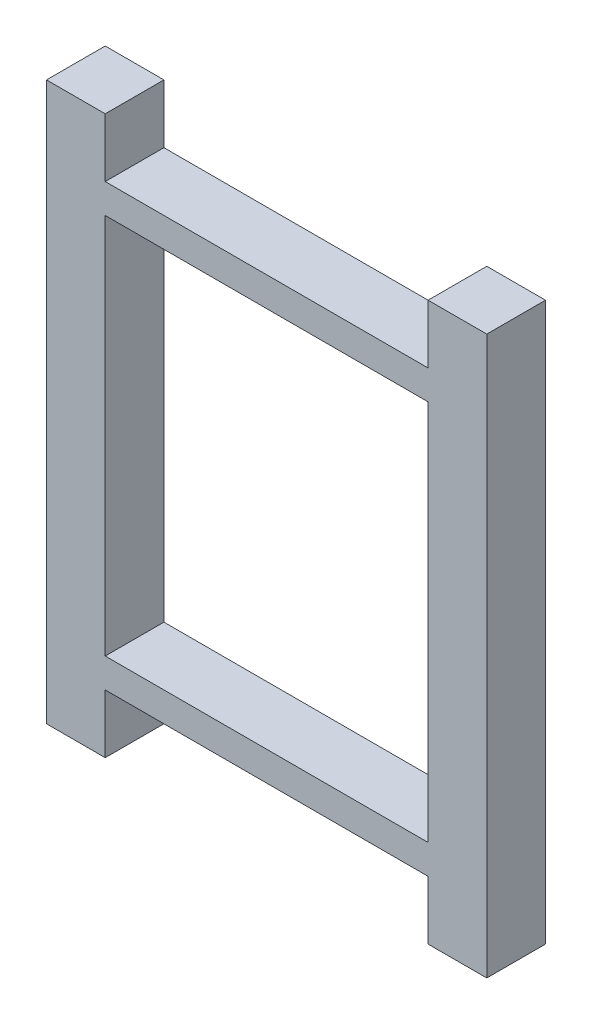
ISO-10303-21;
HEADER;
FILE_DESCRIPTION(('STEP AP214'),'2;1');
FILE_NAME('part.step','',(''),(''),'','','');
FILE_SCHEMA(('AUTOMOTIVE_DESIGN { 1 0 10303 214 1 1 1 1 }'));
ENDSEC;
DATA;
#1=APPLICATION_CONTEXT('core data for automotive mechanical design processes');
#2=APPLICATION_PROTOCOL_DEFINITION('international standard','automotive_design',2000,#1);
#3=PRODUCT_CONTEXT('',#1,'mechanical');
#4=PRODUCT('Part','Part','',(#3));
#5=PRODUCT_RELATED_PRODUCT_CATEGORY('part','',(#4));
#6=PRODUCT_DEFINITION_FORMATION('','',#4);
#7=PRODUCT_DEFINITION_CONTEXT('part definition',#1,'design');
#8=PRODUCT_DEFINITION('design','',#6,#7);
#9=PRODUCT_DEFINITION_SHAPE('','',#8);
#10=(LENGTH_UNIT() NAMED_UNIT(*) SI_UNIT(.MILLI.,.METRE.));
#11=(NAMED_UNIT(*) PLANE_ANGLE_UNIT() SI_UNIT($,.RADIAN.));
#12=(NAMED_UNIT(*) SI_UNIT($,.STERADIAN.) SOLID_ANGLE_UNIT());
#13=UNCERTAINTY_MEASURE_WITH_UNIT(LENGTH_MEASURE(1.E-05),#10,'distance_accuracy_value','');
#14=(GEOMETRIC_REPRESENTATION_CONTEXT(3) GLOBAL_UNCERTAINTY_ASSIGNED_CONTEXT((#13)) GLOBAL_UNIT_ASSIGNED_CONTEXT((#10,
#11,#12)) REPRESENTATION_CONTEXT('',''));
#15=CARTESIAN_POINT('',(0.,0.,0.));
#16=DIRECTION('',(0.,0.,1.));
#17=DIRECTION('',(1.,0.,0.));
#18=AXIS2_PLACEMENT_3D('',#15,#16,#17);
#19=CARTESIAN_POINT('',(0.,48.,6.));
#20=DIRECTION('',(0.,1.,0.));
#21=DIRECTION('',(0.,0.,1.));
#22=AXIS2_PLACEMENT_3D('',#19,#20,#21);
#23=PLANE('',#22);
#24=DIRECTION('',(1.,0.,0.));
#25=VECTOR('',#24,1.);
#26=CARTESIAN_POINT('',(0.,48.,0.));
#27=LINE('',#26,#25);
#28=CARTESIAN_POINT('',(-39.,48.,0.));
#29=VERTEX_POINT('',#28);
#30=CARTESIAN_POINT('',(-6.,48.,0.));
#31=VERTEX_POINT('',#30);
#32=EDGE_CURVE('E209',#29,#31,#27,.T.);
#33=ORIENTED_EDGE('',*,*,#32,.T.);
#34=DIRECTION('',(0.,0.,-1.));
#35=VECTOR('',#34,1.);
#36=CARTESIAN_POINT('',(-6.,48.,6.));
#37=LINE('',#36,#35);
#38=CARTESIAN_POINT('',(-6.,48.,6.));
#39=VERTEX_POINT('',#38);
#40=EDGE_CURVE('E11',#39,#31,#37,.T.);
#41=ORIENTED_EDGE('',*,*,#40,.F.);
#42=DIRECTION('',(1.,0.,0.));
#43=VECTOR('',#42,1.);
#44=CARTESIAN_POINT('',(0.,48.,6.));
#45=LINE('',#44,#43);
#46=CARTESIAN_POINT('',(-39.,48.,6.));
#47=VERTEX_POINT('',#46);
#48=EDGE_CURVE('E162',#47,#39,#45,.T.);
#49=ORIENTED_EDGE('',*,*,#48,.F.);
#50=DIRECTION('',(0.,0.,-1.));
#51=VECTOR('',#50,1.);
#52=CARTESIAN_POINT('',(-39.,48.,6.));
#53=LINE('',#52,#51);
#54=EDGE_CURVE('E54',#47,#29,#53,.T.);
#55=ORIENTED_EDGE('',*,*,#54,.T.);
#56=EDGE_LOOP('',(#33,#41,#49,#55));
#57=FACE_BOUND('',#56,.T.);
#58=ADVANCED_FACE('F35',(#57),#23,.F.);
#59=CARTESIAN_POINT('',(-6.,0.,6.));
#60=DIRECTION('',(1.,0.,0.));
#61=DIRECTION('',(0.,0.,-1.));
#62=AXIS2_PLACEMENT_3D('',#59,#60,#61);
#63=PLANE('',#62);
#64=DIRECTION('',(0.,-1.,0.));
#65=VECTOR('',#64,1.);
#66=CARTESIAN_POINT('',(-6.,0.,0.));
#67=LINE('',#66,#65);
#68=CARTESIAN_POINT('',(-6.,9.,0.));
#69=VERTEX_POINT('',#68);
#70=EDGE_CURVE('E168',#31,#69,#67,.T.);
#71=ORIENTED_EDGE('',*,*,#70,.T.);
#72=DIRECTION('',(0.,0.,-1.));
#73=VECTOR('',#72,1.);
#74=CARTESIAN_POINT('',(-6.,9.,6.));
#75=LINE('',#74,#73);
#76=CARTESIAN_POINT('',(-6.,9.,6.));
#77=VERTEX_POINT('',#76);
#78=EDGE_CURVE('E45',#77,#69,#75,.T.);
#79=ORIENTED_EDGE('',*,*,#78,.F.);
#80=DIRECTION('',(0.,-1.,0.));
#81=VECTOR('',#80,1.);
#82=CARTESIAN_POINT('',(-6.,0.,6.));
#83=LINE('',#82,#81);
#84=EDGE_CURVE('E156',#39,#77,#83,.T.);
#85=ORIENTED_EDGE('',*,*,#84,.F.);
#86=ORIENTED_EDGE('',*,*,#40,.T.);
#87=EDGE_LOOP('',(#71,#79,#85,#86));
#88=FACE_BOUND('',#87,.T.);
#89=ADVANCED_FACE('F167',(#88),#63,.F.);
#90=CARTESIAN_POINT('',(0.,9.,6.));
#91=DIRECTION('',(0.,1.,0.));
#92=DIRECTION('',(0.,0.,1.));
#93=AXIS2_PLACEMENT_3D('',#90,#91,#92);
#94=PLANE('',#93);
#95=DIRECTION('',(1.,0.,0.));
#96=VECTOR('',#95,1.);
#97=CARTESIAN_POINT('',(0.,9.,0.));
#98=LINE('',#97,#96);
#99=CARTESIAN_POINT('',(-39.,9.,0.));
#100=VERTEX_POINT('',#99);
#101=EDGE_CURVE('E212',#100,#69,#98,.T.);
#102=ORIENTED_EDGE('',*,*,#101,.F.);
#103=DIRECTION('',(0.,0.,-1.));
#104=VECTOR('',#103,1.);
#105=CARTESIAN_POINT('',(-39.,9.,6.));
#106=LINE('',#105,#104);
#107=CARTESIAN_POINT('',(-39.,9.,6.));
#108=VERTEX_POINT('',#107);
#109=EDGE_CURVE('E104',#108,#100,#106,.T.);
#110=ORIENTED_EDGE('',*,*,#109,.F.);
#111=DIRECTION('',(1.,0.,0.));
#112=VECTOR('',#111,1.);
#113=CARTESIAN_POINT('',(0.,9.,6.));
#114=LINE('',#113,#112);
#115=EDGE_CURVE('E161',#108,#77,#114,.T.);
#116=ORIENTED_EDGE('',*,*,#115,.T.);
#117=ORIENTED_EDGE('',*,*,#78,.T.);
#118=EDGE_LOOP('',(#102,#110,#116,#117));
#119=FACE_BOUND('',#118,.T.);
#120=ADVANCED_FACE('F172',(#119),#94,.T.);
#121=CARTESIAN_POINT('',(-39.,0.,6.));
#122=DIRECTION('',(1.,0.,0.));
#123=DIRECTION('',(0.,1.,0.));
#124=AXIS2_PLACEMENT_3D('',#121,#122,#123);
#125=PLANE('',#124);
#126=DIRECTION('',(0.,-1.,0.));
#127=VECTOR('',#126,1.);
#128=CARTESIAN_POINT('',(-39.,0.,0.));
#129=LINE('',#128,#127);
#130=CARTESIAN_POINT('',(-39.,6.,0.));
#131=VERTEX_POINT('',#130);
#132=CARTESIAN_POINT('',(-39.,0.,0.));
#133=VERTEX_POINT('',#132);
#134=EDGE_CURVE('E179',#131,#133,#129,.T.);
#135=ORIENTED_EDGE('',*,*,#134,.F.);
#136=DIRECTION('',(0.,0.,-1.));
#137=VECTOR('',#136,1.);
#138=CARTESIAN_POINT('',(-39.,6.,6.));
#139=LINE('',#138,#137);
#140=CARTESIAN_POINT('',(-39.,6.,6.));
#141=VERTEX_POINT('',#140);
#142=EDGE_CURVE('E39',#141,#131,#139,.T.);
#143=ORIENTED_EDGE('',*,*,#142,.F.);
#144=DIRECTION('',(0.,-1.,0.));
#145=VECTOR('',#144,1.);
#146=CARTESIAN_POINT('',(-39.,0.,6.));
#147=LINE('',#146,#145);
#148=CARTESIAN_POINT('',(-39.,0.,6.));
#149=VERTEX_POINT('',#148);
#150=EDGE_CURVE('E217',#141,#149,#147,.T.);
#151=ORIENTED_EDGE('',*,*,#150,.T.);
#152=DIRECTION('',(0.,0.,-1.));
#153=VECTOR('',#152,1.);
#154=CARTESIAN_POINT('',(-39.,0.,6.));
#155=LINE('',#154,#153);
#156=EDGE_CURVE('E175',#149,#133,#155,.T.);
#157=ORIENTED_EDGE('',*,*,#156,.T.);
#158=EDGE_LOOP('',(#135,#143,#151,#157));
#159=FACE_BOUND('',#158,.T.);
#160=ADVANCED_FACE('F37',(#159),#125,.T.);
#161=CARTESIAN_POINT('',(0.,6.,6.));
#162=DIRECTION('',(0.,-1.,0.));
#163=DIRECTION('',(1.,0.,0.));
#164=AXIS2_PLACEMENT_3D('',#161,#162,#163);
#165=PLANE('',#164);
#166=DIRECTION('',(-1.,0.,0.));
#167=VECTOR('',#166,1.);
#168=CARTESIAN_POINT('',(0.,6.,0.));
#169=LINE('',#168,#167);
#170=CARTESIAN_POINT('',(-6.,6.,0.));
#171=VERTEX_POINT('',#170);
#172=EDGE_CURVE('E182',#171,#131,#169,.T.);
#173=ORIENTED_EDGE('',*,*,#172,.F.);
#174=DIRECTION('',(0.,0.,-1.));
#175=VECTOR('',#174,1.);
#176=CARTESIAN_POINT('',(-6.,6.,6.));
#177=LINE('',#176,#175);
#178=CARTESIAN_POINT('',(-6.,6.,6.));
#179=VERTEX_POINT('',#178);
#180=EDGE_CURVE('E240',#179,#171,#177,.T.);
#181=ORIENTED_EDGE('',*,*,#180,.F.);
#182=DIRECTION('',(-1.,0.,0.));
#183=VECTOR('',#182,1.);
#184=CARTESIAN_POINT('',(0.,6.,6.));
#185=LINE('',#184,#183);
#186=EDGE_CURVE('E249',#179,#141,#185,.T.);
#187=ORIENTED_EDGE('',*,*,#186,.T.);
#188=ORIENTED_EDGE('',*,*,#142,.T.);
#189=EDGE_LOOP('',(#173,#181,#187,#188));
#190=FACE_BOUND('',#189,.T.);
#191=ADVANCED_FACE('F247',(#190),#165,.T.);
#192=CARTESIAN_POINT('',(-6.,0.,6.));
#193=DIRECTION('',(-1.,0.,0.));
#194=DIRECTION('',(0.,-1.,0.));
#195=AXIS2_PLACEMENT_3D('',#192,#193,#194);
#196=PLANE('',#195);
#197=DIRECTION('',(0.,1.,0.));
#198=VECTOR('',#197,1.);
#199=CARTESIAN_POINT('',(-6.,0.,0.));
#200=LINE('',#199,#198);
#201=CARTESIAN_POINT('',(-6.,0.,0.));
#202=VERTEX_POINT('',#201);
#203=EDGE_CURVE('E185',#202,#171,#200,.T.);
#204=ORIENTED_EDGE('',*,*,#203,.F.);
#205=DIRECTION('',(0.,0.,-1.));
#206=VECTOR('',#205,1.);
#207=CARTESIAN_POINT('',(-6.,0.,6.));
#208=LINE('',#207,#206);
#209=CARTESIAN_POINT('',(-6.,0.,6.));
#210=VERTEX_POINT('',#209);
#211=EDGE_CURVE('E239',#210,#202,#208,.T.);
#212=ORIENTED_EDGE('',*,*,#211,.F.);
#213=DIRECTION('',(0.,1.,0.));
#214=VECTOR('',#213,1.);
#215=CARTESIAN_POINT('',(-6.,0.,6.));
#216=LINE('',#215,#214);
#217=EDGE_CURVE('E259',#210,#179,#216,.T.);
#218=ORIENTED_EDGE('',*,*,#217,.T.);
#219=ORIENTED_EDGE('',*,*,#180,.T.);
#220=EDGE_LOOP('',(#204,#212,#218,#219));
#221=FACE_BOUND('',#220,.T.);
#222=ADVANCED_FACE('F257',(#221),#196,.T.);
#223=CARTESIAN_POINT('',(0.,0.,6.));
#224=DIRECTION('',(0.,-1.,0.));
#225=DIRECTION('',(1.,0.,0.));
#226=AXIS2_PLACEMENT_3D('',#223,#224,#225);
#227=PLANE('',#226);
#228=DIRECTION('',(-1.,0.,0.));
#229=VECTOR('',#228,1.);
#230=CARTESIAN_POINT('',(0.,0.,0.));
#231=LINE('',#230,#229);
#232=CARTESIAN_POINT('',(0.,0.,0.));
#233=VERTEX_POINT('',#232);
#234=EDGE_CURVE('E188',#233,#202,#231,.T.);
#235=ORIENTED_EDGE('',*,*,#234,.F.);
#236=DIRECTION('',(0.,0.,-1.));
#237=VECTOR('',#236,1.);
#238=CARTESIAN_POINT('',(0.,0.,6.));
#239=LINE('',#238,#237);
#240=CARTESIAN_POINT('',(0.,0.,6.));
#241=VERTEX_POINT('',#240);
#242=EDGE_CURVE('E237',#241,#233,#239,.T.);
#243=ORIENTED_EDGE('',*,*,#242,.F.);
#244=DIRECTION('',(-1.,0.,0.));
#245=VECTOR('',#244,1.);
#246=CARTESIAN_POINT('',(0.,0.,6.));
#247=LINE('',#246,#245);
#248=EDGE_CURVE('E264',#241,#210,#247,.T.);
#249=ORIENTED_EDGE('',*,*,#248,.T.);
#250=ORIENTED_EDGE('',*,*,#211,.T.);
#251=EDGE_LOOP('',(#235,#243,#249,#250));
#252=FACE_BOUND('',#251,.T.);
#253=ADVANCED_FACE('F266',(#252),#227,.T.);
#254=CARTESIAN_POINT('',(0.,0.,6.));
#255=DIRECTION('',(-1.,0.,0.));
#256=DIRECTION('',(0.,-1.,0.));
#257=AXIS2_PLACEMENT_3D('',#254,#255,#256);
#258=PLANE('',#257);
#259=DIRECTION('',(0.,1.,0.));
#260=VECTOR('',#259,1.);
#261=CARTESIAN_POINT('',(0.,0.,0.));
#262=LINE('',#261,#260);
#263=CARTESIAN_POINT('',(0.,57.,0.));
#264=VERTEX_POINT('',#263);
#265=EDGE_CURVE('E191',#233,#264,#262,.T.);
#266=ORIENTED_EDGE('',*,*,#265,.T.);
#267=DIRECTION('',(0.,0.,-1.));
#268=VECTOR('',#267,1.);
#269=CARTESIAN_POINT('',(0.,57.,6.));
#270=LINE('',#269,#268);
#271=CARTESIAN_POINT('',(0.,57.,6.));
#272=VERTEX_POINT('',#271);
#273=EDGE_CURVE('E234',#272,#264,#270,.T.);
#274=ORIENTED_EDGE('',*,*,#273,.F.);
#275=DIRECTION('',(0.,1.,0.));
#276=VECTOR('',#275,1.);
#277=CARTESIAN_POINT('',(0.,0.,6.));
#278=LINE('',#277,#276);
#279=EDGE_CURVE('E268',#241,#272,#278,.T.);
#280=ORIENTED_EDGE('',*,*,#279,.F.);
#281=ORIENTED_EDGE('',*,*,#242,.T.);
#282=EDGE_LOOP('',(#266,#274,#280,#281));
#283=FACE_BOUND('',#282,.T.);
#284=ADVANCED_FACE('F332',(#283),#258,.F.);
#285=CARTESIAN_POINT('',(0.,57.,6.));
#286=DIRECTION('',(0.,-1.,0.));
#287=DIRECTION('',(1.,0.,0.));
#288=AXIS2_PLACEMENT_3D('',#285,#286,#287);
#289=PLANE('',#288);
#290=DIRECTION('',(-1.,0.,0.));
#291=VECTOR('',#290,1.);
#292=CARTESIAN_POINT('',(0.,57.,0.));
#293=LINE('',#292,#291);
#294=CARTESIAN_POINT('',(-6.,57.,0.));
#295=VERTEX_POINT('',#294);
#296=EDGE_CURVE('E194',#264,#295,#293,.T.);
#297=ORIENTED_EDGE('',*,*,#296,.T.);
#298=DIRECTION('',(0.,0.,-1.));
#299=VECTOR('',#298,1.);
#300=CARTESIAN_POINT('',(-6.,57.,6.));
#301=LINE('',#300,#299);
#302=CARTESIAN_POINT('',(-6.,57.,6.));
#303=VERTEX_POINT('',#302);
#304=EDGE_CURVE('E232',#303,#295,#301,.T.);
#305=ORIENTED_EDGE('',*,*,#304,.F.);
#306=DIRECTION('',(-1.,0.,0.));
#307=VECTOR('',#306,1.);
#308=CARTESIAN_POINT('',(0.,57.,6.));
#309=LINE('',#308,#307);
#310=EDGE_CURVE('E271',#272,#303,#309,.T.);
#311=ORIENTED_EDGE('',*,*,#310,.F.);
#312=ORIENTED_EDGE('',*,*,#273,.T.);
#313=EDGE_LOOP('',(#297,#305,#311,#312));
#314=FACE_BOUND('',#313,.T.);
#315=ADVANCED_FACE('F297',(#314),#289,.F.);
#316=CARTESIAN_POINT('',(-6.,0.,6.));
#317=DIRECTION('',(-1.,0.,0.));
#318=DIRECTION('',(0.,0.,1.));
#319=AXIS2_PLACEMENT_3D('',#316,#317,#318);
#320=PLANE('',#319);
#321=DIRECTION('',(0.,1.,0.));
#322=VECTOR('',#321,1.);
#323=CARTESIAN_POINT('',(-6.,0.,0.));
#324=LINE('',#323,#322);
#325=CARTESIAN_POINT('',(-6.,51.,0.));
#326=VERTEX_POINT('',#325);
#327=EDGE_CURVE('E197',#326,#295,#324,.T.);
#328=ORIENTED_EDGE('',*,*,#327,.F.);
#329=DIRECTION('',(0.,0.,-1.));
#330=VECTOR('',#329,1.);
#331=CARTESIAN_POINT('',(-6.,51.,6.));
#332=LINE('',#331,#330);
#333=CARTESIAN_POINT('',(-6.,51.,6.));
#334=VERTEX_POINT('',#333);
#335=EDGE_CURVE('E230',#334,#326,#332,.T.);
#336=ORIENTED_EDGE('',*,*,#335,.F.);
#337=DIRECTION('',(0.,1.,0.));
#338=VECTOR('',#337,1.);
#339=CARTESIAN_POINT('',(-6.,0.,6.));
#340=LINE('',#339,#338);
#341=EDGE_CURVE('E289',#334,#303,#340,.T.);
#342=ORIENTED_EDGE('',*,*,#341,.T.);
#343=ORIENTED_EDGE('',*,*,#304,.T.);
#344=EDGE_LOOP('',(#328,#336,#342,#343));
#345=FACE_BOUND('',#344,.T.);
#346=ADVANCED_FACE('F301',(#345),#320,.T.);
#347=CARTESIAN_POINT('',(0.,51.,6.));
#348=DIRECTION('',(0.,1.,0.));
#349=DIRECTION('',(-1.,0.,0.));
#350=AXIS2_PLACEMENT_3D('',#347,#348,#349);
#351=PLANE('',#350);
#352=DIRECTION('',(1.,0.,0.));
#353=VECTOR('',#352,1.);
#354=CARTESIAN_POINT('',(0.,51.,0.));
#355=LINE('',#354,#353);
#356=CARTESIAN_POINT('',(-39.,51.,0.));
#357=VERTEX_POINT('',#356);
#358=EDGE_CURVE('E201',#357,#326,#355,.T.);
#359=ORIENTED_EDGE('',*,*,#358,.F.);
#360=DIRECTION('',(0.,0.,-1.));
#361=VECTOR('',#360,1.);
#362=CARTESIAN_POINT('',(-39.,51.,6.));
#363=LINE('',#362,#361);
#364=CARTESIAN_POINT('',(-39.,51.,6.));
#365=VERTEX_POINT('',#364);
#366=EDGE_CURVE('E228',#365,#357,#363,.T.);
#367=ORIENTED_EDGE('',*,*,#366,.F.);
#368=DIRECTION('',(1.,0.,0.));
#369=VECTOR('',#368,1.);
#370=CARTESIAN_POINT('',(0.,51.,6.));
#371=LINE('',#370,#369);
#372=EDGE_CURVE('E286',#365,#334,#371,.T.);
#373=ORIENTED_EDGE('',*,*,#372,.T.);
#374=ORIENTED_EDGE('',*,*,#335,.T.);
#375=EDGE_LOOP('',(#359,#367,#373,#374));
#376=FACE_BOUND('',#375,.T.);
#377=ADVANCED_FACE('F304',(#376),#351,.T.);
#378=CARTESIAN_POINT('',(-39.,0.,6.));
#379=DIRECTION('',(-1.,0.,0.));
#380=DIRECTION('',(0.,0.,1.));
#381=AXIS2_PLACEMENT_3D('',#378,#379,#380);
#382=PLANE('',#381);
#383=DIRECTION('',(0.,1.,0.));
#384=VECTOR('',#383,1.);
#385=CARTESIAN_POINT('',(-39.,0.,0.));
#386=LINE('',#385,#384);
#387=CARTESIAN_POINT('',(-39.,57.,0.));
#388=VERTEX_POINT('',#387);
#389=EDGE_CURVE('E204',#357,#388,#386,.T.);
#390=ORIENTED_EDGE('',*,*,#389,.T.);
#391=DIRECTION('',(0.,0.,-1.));
#392=VECTOR('',#391,1.);
#393=CARTESIAN_POINT('',(-39.,57.,6.));
#394=LINE('',#393,#392);
#395=CARTESIAN_POINT('',(-39.,57.,6.));
#396=VERTEX_POINT('',#395);
#397=EDGE_CURVE('E225',#396,#388,#394,.T.);
#398=ORIENTED_EDGE('',*,*,#397,.F.);
#399=DIRECTION('',(0.,1.,0.));
#400=VECTOR('',#399,1.);
#401=CARTESIAN_POINT('',(-39.,0.,6.));
#402=LINE('',#401,#400);
#403=EDGE_CURVE('E282',#365,#396,#402,.T.);
#404=ORIENTED_EDGE('',*,*,#403,.F.);
#405=ORIENTED_EDGE('',*,*,#366,.T.);
#406=EDGE_LOOP('',(#390,#398,#404,#405));
#407=FACE_BOUND('',#406,.T.);
#408=ADVANCED_FACE('F310',(#407),#382,.F.);
#409=CARTESIAN_POINT('',(-45.,57.,0.));
#410=VERTEX_POINT('',#409);
#411=EDGE_CURVE('E198',#388,#410,#293,.T.);
#412=ORIENTED_EDGE('',*,*,#411,.T.);
#413=DIRECTION('',(0.,0.,-1.));
#414=VECTOR('',#413,1.);
#415=CARTESIAN_POINT('',(-45.,57.,6.));
#416=LINE('',#415,#414);
#417=CARTESIAN_POINT('',(-45.,57.,6.));
#418=VERTEX_POINT('',#417);
#419=EDGE_CURVE('E223',#418,#410,#416,.T.);
#420=ORIENTED_EDGE('',*,*,#419,.F.);
#421=EDGE_CURVE('E278',#396,#418,#309,.T.);
#422=ORIENTED_EDGE('',*,*,#421,.F.);
#423=ORIENTED_EDGE('',*,*,#397,.T.);
#424=EDGE_LOOP('',(#412,#420,#422,#423));
#425=FACE_BOUND('',#424,.T.);
#426=ADVANCED_FACE('F315',(#425),#289,.F.);
#427=CARTESIAN_POINT('',(-45.,0.,6.));
#428=DIRECTION('',(-1.,0.,0.));
#429=DIRECTION('',(0.,0.,1.));
#430=AXIS2_PLACEMENT_3D('',#427,#428,#429);
#431=PLANE('',#430);
#432=DIRECTION('',(0.,1.,0.));
#433=VECTOR('',#432,1.);
#434=CARTESIAN_POINT('',(-45.,0.,0.));
#435=LINE('',#434,#433);
#436=CARTESIAN_POINT('',(-45.,0.,0.));
#437=VERTEX_POINT('',#436);
#438=EDGE_CURVE('E206',#437,#410,#435,.T.);
#439=ORIENTED_EDGE('',*,*,#438,.F.);
#440=DIRECTION('',(0.,0.,-1.));
#441=VECTOR('',#440,1.);
#442=CARTESIAN_POINT('',(-45.,0.,6.));
#443=LINE('',#442,#441);
#444=CARTESIAN_POINT('',(-45.,0.,6.));
#445=VERTEX_POINT('',#444);
#446=EDGE_CURVE('E221',#445,#437,#443,.T.);
#447=ORIENTED_EDGE('',*,*,#446,.F.);
#448=DIRECTION('',(0.,1.,0.));
#449=VECTOR('',#448,1.);
#450=CARTESIAN_POINT('',(-45.,0.,6.));
#451=LINE('',#450,#449);
#452=EDGE_CURVE('E274',#445,#418,#451,.T.);
#453=ORIENTED_EDGE('',*,*,#452,.T.);
#454=ORIENTED_EDGE('',*,*,#419,.T.);
#455=EDGE_LOOP('',(#439,#447,#453,#454));
#456=FACE_BOUND('',#455,.T.);
#457=ADVANCED_FACE('F317',(#456),#431,.T.);
#458=EDGE_CURVE('E192',#133,#437,#231,.T.);
#459=ORIENTED_EDGE('',*,*,#458,.F.);
#460=ORIENTED_EDGE('',*,*,#156,.F.);
#461=EDGE_CURVE('E270',#149,#445,#247,.T.);
#462=ORIENTED_EDGE('',*,*,#461,.T.);
#463=ORIENTED_EDGE('',*,*,#446,.T.);
#464=EDGE_LOOP('',(#459,#460,#462,#463));
#465=FACE_BOUND('',#464,.T.);
#466=ADVANCED_FACE('F318',(#465),#227,.T.);
#467=CARTESIAN_POINT('',(-39.,0.,6.));
#468=DIRECTION('',(1.,0.,0.));
#469=DIRECTION('',(0.,0.,-1.));
#470=AXIS2_PLACEMENT_3D('',#467,#468,#469);
#471=PLANE('',#470);
#472=DIRECTION('',(0.,-1.,0.));
#473=VECTOR('',#472,1.);
#474=CARTESIAN_POINT('',(-39.,0.,0.));
#475=LINE('',#474,#473);
#476=EDGE_CURVE('E214',#29,#100,#475,.T.);
#477=ORIENTED_EDGE('',*,*,#476,.F.);
#478=ORIENTED_EDGE('',*,*,#54,.F.);
#479=DIRECTION('',(0.,-1.,0.));
#480=VECTOR('',#479,1.);
#481=CARTESIAN_POINT('',(-39.,0.,6.));
#482=LINE('',#481,#480);
#483=EDGE_CURVE('E173',#47,#108,#482,.T.);
#484=ORIENTED_EDGE('',*,*,#483,.T.);
#485=ORIENTED_EDGE('',*,*,#109,.T.);
#486=EDGE_LOOP('',(#477,#478,#484,#485));
#487=FACE_BOUND('',#486,.T.);
#488=ADVANCED_FACE('F322',(#487),#471,.T.);
#489=CARTESIAN_POINT('',(0.,0.,6.));
#490=DIRECTION('',(0.,0.,1.));
#491=DIRECTION('',(1.,0.,0.));
#492=AXIS2_PLACEMENT_3D('',#489,#490,#491);
#493=PLANE('',#492);
#494=ORIENTED_EDGE('',*,*,#150,.F.);
#495=ORIENTED_EDGE('',*,*,#186,.F.);
#496=ORIENTED_EDGE('',*,*,#217,.F.);
#497=ORIENTED_EDGE('',*,*,#248,.F.);
#498=ORIENTED_EDGE('',*,*,#279,.T.);
#499=ORIENTED_EDGE('',*,*,#310,.T.);
#500=ORIENTED_EDGE('',*,*,#341,.F.);
#501=ORIENTED_EDGE('',*,*,#372,.F.);
#502=ORIENTED_EDGE('',*,*,#403,.T.);
#503=ORIENTED_EDGE('',*,*,#421,.T.);
#504=ORIENTED_EDGE('',*,*,#452,.F.);
#505=ORIENTED_EDGE('',*,*,#461,.F.);
#506=EDGE_LOOP('',(#494,#495,#496,#497,#498,#499,#500,#501,#502,#503,#504,#505));
#507=FACE_BOUND('',#506,.T.);
#508=ORIENTED_EDGE('',*,*,#48,.T.);
#509=ORIENTED_EDGE('',*,*,#84,.T.);
#510=ORIENTED_EDGE('',*,*,#115,.F.);
#511=ORIENTED_EDGE('',*,*,#483,.F.);
#512=EDGE_LOOP('',(#508,#509,#510,#511));
#513=FACE_BOUND('',#512,.T.);
#514=ADVANCED_FACE('F158',(#507,#513),#493,.T.);
#515=CARTESIAN_POINT('',(0.,0.,0.));
#516=DIRECTION('',(0.,0.,1.));
#517=DIRECTION('',(1.,0.,0.));
#518=AXIS2_PLACEMENT_3D('',#515,#516,#517);
#519=PLANE('',#518);
#520=ORIENTED_EDGE('',*,*,#134,.T.);
#521=ORIENTED_EDGE('',*,*,#458,.T.);
#522=ORIENTED_EDGE('',*,*,#438,.T.);
#523=ORIENTED_EDGE('',*,*,#411,.F.);
#524=ORIENTED_EDGE('',*,*,#389,.F.);
#525=ORIENTED_EDGE('',*,*,#358,.T.);
#526=ORIENTED_EDGE('',*,*,#327,.T.);
#527=ORIENTED_EDGE('',*,*,#296,.F.);
#528=ORIENTED_EDGE('',*,*,#265,.F.);
#529=ORIENTED_EDGE('',*,*,#234,.T.);
#530=ORIENTED_EDGE('',*,*,#203,.T.);
#531=ORIENTED_EDGE('',*,*,#172,.T.);
#532=EDGE_LOOP('',(#520,#521,#522,#523,#524,#525,#526,#527,#528,#529,#530,#531));
#533=FACE_BOUND('',#532,.T.);
#534=ORIENTED_EDGE('',*,*,#32,.F.);
#535=ORIENTED_EDGE('',*,*,#476,.T.);
#536=ORIENTED_EDGE('',*,*,#101,.T.);
#537=ORIENTED_EDGE('',*,*,#70,.F.);
#538=EDGE_LOOP('',(#534,#535,#536,#537));
#539=FACE_BOUND('',#538,.T.);
#540=ADVANCED_FACE('F253',(#533,#539),#519,.F.);
#541=CLOSED_SHELL('',(#58,#89,#120,#160,#191,#222,#253,#284,#315,#346,#377,#408,#426,#457,#466,
#488,#514,#540));
#542=MANIFOLD_SOLID_BREP('B2',#541);
#543=ADVANCED_BREP_SHAPE_REPRESENTATION('',(#18,#542),#14);
#544=SHAPE_DEFINITION_REPRESENTATION(#9,#543);
ENDSEC;
END-ISO-10303-21;
